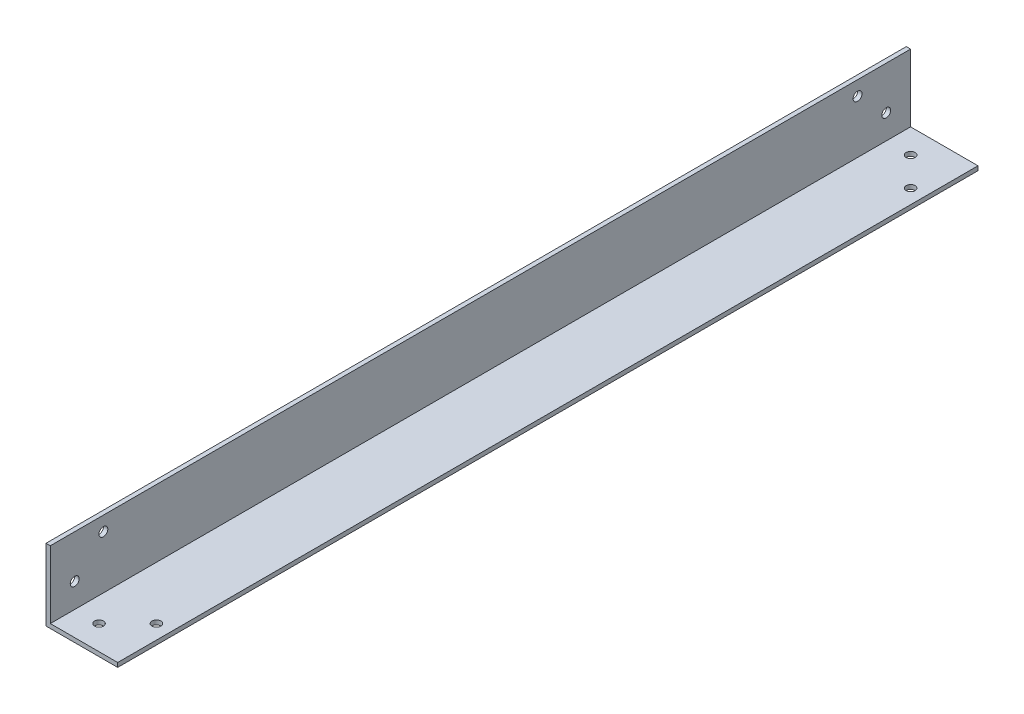
ISO-10303-21;
HEADER;
FILE_DESCRIPTION(('STEP AP214'),'2;1');
FILE_NAME('part.step','',(''),(''),'','','');
FILE_SCHEMA(('AUTOMOTIVE_DESIGN { 1 0 10303 214 1 1 1 1 }'));
ENDSEC;
DATA;
#1=APPLICATION_CONTEXT('core data for automotive mechanical design processes');
#2=APPLICATION_PROTOCOL_DEFINITION('international standard','automotive_design',2000,#1);
#3=PRODUCT_CONTEXT('',#1,'mechanical');
#4=PRODUCT('Part','Part','',(#3));
#5=PRODUCT_RELATED_PRODUCT_CATEGORY('part','',(#4));
#6=PRODUCT_DEFINITION_FORMATION('','',#4);
#7=PRODUCT_DEFINITION_CONTEXT('part definition',#1,'design');
#8=PRODUCT_DEFINITION('design','',#6,#7);
#9=PRODUCT_DEFINITION_SHAPE('','',#8);
#10=(LENGTH_UNIT() NAMED_UNIT(*) SI_UNIT(.MILLI.,.METRE.));
#11=(NAMED_UNIT(*) PLANE_ANGLE_UNIT() SI_UNIT($,.RADIAN.));
#12=(NAMED_UNIT(*) SI_UNIT($,.STERADIAN.) SOLID_ANGLE_UNIT());
#13=UNCERTAINTY_MEASURE_WITH_UNIT(LENGTH_MEASURE(1.E-05),#10,'distance_accuracy_value','');
#14=(GEOMETRIC_REPRESENTATION_CONTEXT(3) GLOBAL_UNCERTAINTY_ASSIGNED_CONTEXT((#13)) GLOBAL_UNIT_ASSIGNED_CONTEXT((#10,
#11,#12)) REPRESENTATION_CONTEXT('',''));
#15=CARTESIAN_POINT('',(0.,0.,0.));
#16=DIRECTION('',(0.,0.,1.));
#17=DIRECTION('',(1.,0.,0.));
#18=AXIS2_PLACEMENT_3D('',#15,#16,#17);
#19=CARTESIAN_POINT('',(25.,0.,300.));
#20=DIRECTION('',(0.,1.,0.));
#21=DIRECTION('',(-1.,0.,0.));
#22=AXIS2_PLACEMENT_3D('',#19,#20,#21);
#23=PLANE('',#22);
#24=CARTESIAN_POINT('',(9.99999999809248,0.,8.50000000000001));
#25=DIRECTION('',(0.,-1.,0.));
#26=DIRECTION('',(1.,0.,0.));
#27=AXIS2_PLACEMENT_3D('',#24,#25,#26);
#28=CIRCLE('',#27,1.55);
#29=CARTESIAN_POINT('',(11.5499999980925,0.,8.50000000000001));
#30=VERTEX_POINT('',#29);
#31=EDGE_CURVE('E156',#30,#30,#28,.T.);
#32=ORIENTED_EDGE('',*,*,#31,.F.);
#33=EDGE_LOOP('',(#32));
#34=FACE_BOUND('',#33,.T.);
#35=CARTESIAN_POINT('',(19.9999999961829,0.,18.5));
#36=DIRECTION('',(0.,-1.,0.));
#37=DIRECTION('',(1.,0.,0.));
#38=AXIS2_PLACEMENT_3D('',#35,#36,#37);
#39=CIRCLE('',#38,1.55);
#40=CARTESIAN_POINT('',(21.5499999961828,0.,18.5));
#41=VERTEX_POINT('',#40);
#42=EDGE_CURVE('E146',#41,#41,#39,.T.);
#43=ORIENTED_EDGE('',*,*,#42,.F.);
#44=EDGE_LOOP('',(#43));
#45=FACE_BOUND('',#44,.T.);
#46=CARTESIAN_POINT('',(9.99999999809244,0.,291.5));
#47=DIRECTION('',(0.,-1.,0.));
#48=DIRECTION('',(1.,0.,0.));
#49=AXIS2_PLACEMENT_3D('',#46,#47,#48);
#50=CIRCLE('',#49,1.55000000000001);
#51=CARTESIAN_POINT('',(11.5499999980925,0.,291.5));
#52=VERTEX_POINT('',#51);
#53=EDGE_CURVE('E143',#52,#52,#50,.T.);
#54=ORIENTED_EDGE('',*,*,#53,.F.);
#55=EDGE_LOOP('',(#54));
#56=FACE_BOUND('',#55,.T.);
#57=CARTESIAN_POINT('',(19.9999999961829,0.,281.5));
#58=DIRECTION('',(0.,-1.,0.));
#59=DIRECTION('',(1.,0.,0.));
#60=AXIS2_PLACEMENT_3D('',#57,#58,#59);
#61=CIRCLE('',#60,1.55000000000002);
#62=CARTESIAN_POINT('',(21.5499999961829,0.,281.5));
#63=VERTEX_POINT('',#62);
#64=EDGE_CURVE('E140',#63,#63,#61,.T.);
#65=ORIENTED_EDGE('',*,*,#64,.F.);
#66=EDGE_LOOP('',(#65));
#67=FACE_BOUND('',#66,.T.);
#68=DIRECTION('',(1.,0.,0.));
#69=VECTOR('',#68,1.);
#70=CARTESIAN_POINT('',(25.,0.,0.));
#71=LINE('',#70,#69);
#72=CARTESIAN_POINT('',(0.,0.,0.));
#73=VERTEX_POINT('',#72);
#74=CARTESIAN_POINT('',(25.,0.,0.));
#75=VERTEX_POINT('',#74);
#76=EDGE_CURVE('E119',#73,#75,#71,.T.);
#77=ORIENTED_EDGE('',*,*,#76,.T.);
#78=DIRECTION('',(0.,0.,-1.));
#79=VECTOR('',#78,1.);
#80=CARTESIAN_POINT('',(25.,0.,300.));
#81=LINE('',#80,#79);
#82=CARTESIAN_POINT('',(25.,0.,300.));
#83=VERTEX_POINT('',#82);
#84=EDGE_CURVE('E11',#83,#75,#81,.T.);
#85=ORIENTED_EDGE('',*,*,#84,.F.);
#86=DIRECTION('',(1.,0.,0.));
#87=VECTOR('',#86,1.);
#88=CARTESIAN_POINT('',(25.,0.,300.));
#89=LINE('',#88,#87);
#90=CARTESIAN_POINT('',(0.,0.,300.));
#91=VERTEX_POINT('',#90);
#92=EDGE_CURVE('E130',#91,#83,#89,.T.);
#93=ORIENTED_EDGE('',*,*,#92,.F.);
#94=DIRECTION('',(0.,0.,-1.));
#95=VECTOR('',#94,1.);
#96=CARTESIAN_POINT('',(0.,0.,300.));
#97=LINE('',#96,#95);
#98=EDGE_CURVE('E115',#91,#73,#97,.T.);
#99=ORIENTED_EDGE('',*,*,#98,.T.);
#100=EDGE_LOOP('',(#77,#85,#93,#99));
#101=FACE_BOUND('',#100,.T.);
#102=ADVANCED_FACE('F33',(#34,#45,#56,#67,#101),#23,.F.);
#103=CARTESIAN_POINT('',(25.,1.5,300.));
#104=DIRECTION('',(-1.,0.,0.));
#105=DIRECTION('',(0.,0.,1.));
#106=AXIS2_PLACEMENT_3D('',#103,#104,#105);
#107=PLANE('',#106);
#108=DIRECTION('',(0.,1.,0.));
#109=VECTOR('',#108,1.);
#110=CARTESIAN_POINT('',(25.,1.5,0.));
#111=LINE('',#110,#109);
#112=CARTESIAN_POINT('',(25.,1.5,0.));
#113=VERTEX_POINT('',#112);
#114=EDGE_CURVE('E122',#75,#113,#111,.T.);
#115=ORIENTED_EDGE('',*,*,#114,.T.);
#116=DIRECTION('',(0.,0.,-1.));
#117=VECTOR('',#116,1.);
#118=CARTESIAN_POINT('',(25.,1.5,300.));
#119=LINE('',#118,#117);
#120=CARTESIAN_POINT('',(25.,1.5,300.));
#121=VERTEX_POINT('',#120);
#122=EDGE_CURVE('E42',#121,#113,#119,.T.);
#123=ORIENTED_EDGE('',*,*,#122,.F.);
#124=DIRECTION('',(0.,1.,0.));
#125=VECTOR('',#124,1.);
#126=CARTESIAN_POINT('',(25.,1.5,300.));
#127=LINE('',#126,#125);
#128=EDGE_CURVE('E88',#83,#121,#127,.T.);
#129=ORIENTED_EDGE('',*,*,#128,.F.);
#130=ORIENTED_EDGE('',*,*,#84,.T.);
#131=EDGE_LOOP('',(#115,#123,#129,#130));
#132=FACE_BOUND('',#131,.T.);
#133=ADVANCED_FACE('F186',(#132),#107,.F.);
#134=CARTESIAN_POINT('',(1.5,1.5,300.));
#135=DIRECTION('',(0.,-1.,0.));
#136=DIRECTION('',(1.,0.,0.));
#137=AXIS2_PLACEMENT_3D('',#134,#135,#136);
#138=PLANE('',#137);
#139=CARTESIAN_POINT('',(9.99999999809248,1.5,8.50000000000001));
#140=DIRECTION('',(0.,-1.,0.));
#141=DIRECTION('',(1.,0.,0.));
#142=AXIS2_PLACEMENT_3D('',#139,#140,#141);
#143=CIRCLE('',#142,1.55);
#144=CARTESIAN_POINT('',(11.5499999980925,1.5,8.50000000000001));
#145=VERTEX_POINT('',#144);
#146=EDGE_CURVE('E36',#145,#145,#143,.T.);
#147=ORIENTED_EDGE('',*,*,#146,.T.);
#148=EDGE_LOOP('',(#147));
#149=FACE_BOUND('',#148,.T.);
#150=CARTESIAN_POINT('',(19.9999999961829,1.5,18.5));
#151=DIRECTION('',(0.,-1.,0.));
#152=DIRECTION('',(1.,0.,0.));
#153=AXIS2_PLACEMENT_3D('',#150,#151,#152);
#154=CIRCLE('',#153,1.55);
#155=CARTESIAN_POINT('',(21.5499999961828,1.5,18.5));
#156=VERTEX_POINT('',#155);
#157=EDGE_CURVE('E144',#156,#156,#154,.T.);
#158=ORIENTED_EDGE('',*,*,#157,.T.);
#159=EDGE_LOOP('',(#158));
#160=FACE_BOUND('',#159,.T.);
#161=CARTESIAN_POINT('',(9.99999999809244,1.5,291.5));
#162=DIRECTION('',(0.,-1.,0.));
#163=DIRECTION('',(1.,0.,0.));
#164=AXIS2_PLACEMENT_3D('',#161,#162,#163);
#165=CIRCLE('',#164,1.55000000000001);
#166=CARTESIAN_POINT('',(11.5499999980925,1.5,291.5));
#167=VERTEX_POINT('',#166);
#168=EDGE_CURVE('E141',#167,#167,#165,.T.);
#169=ORIENTED_EDGE('',*,*,#168,.T.);
#170=EDGE_LOOP('',(#169));
#171=FACE_BOUND('',#170,.T.);
#172=CARTESIAN_POINT('',(19.9999999961829,1.5,281.5));
#173=DIRECTION('',(0.,-1.,0.));
#174=DIRECTION('',(1.,0.,0.));
#175=AXIS2_PLACEMENT_3D('',#172,#173,#174);
#176=CIRCLE('',#175,1.55000000000002);
#177=CARTESIAN_POINT('',(21.5499999961829,1.5,281.5));
#178=VERTEX_POINT('',#177);
#179=EDGE_CURVE('E136',#178,#178,#176,.T.);
#180=ORIENTED_EDGE('',*,*,#179,.T.);
#181=EDGE_LOOP('',(#180));
#182=FACE_BOUND('',#181,.T.);
#183=DIRECTION('',(-1.,0.,0.));
#184=VECTOR('',#183,1.);
#185=CARTESIAN_POINT('',(1.5,1.5,0.));
#186=LINE('',#185,#184);
#187=CARTESIAN_POINT('',(1.5,1.5,0.));
#188=VERTEX_POINT('',#187);
#189=EDGE_CURVE('E125',#113,#188,#186,.T.);
#190=ORIENTED_EDGE('',*,*,#189,.T.);
#191=DIRECTION('',(0.,0.,-1.));
#192=VECTOR('',#191,1.);
#193=CARTESIAN_POINT('',(1.5,1.5,300.));
#194=LINE('',#193,#192);
#195=CARTESIAN_POINT('',(1.5,1.5,300.));
#196=VERTEX_POINT('',#195);
#197=EDGE_CURVE('E110',#196,#188,#194,.T.);
#198=ORIENTED_EDGE('',*,*,#197,.F.);
#199=DIRECTION('',(-1.,0.,0.));
#200=VECTOR('',#199,1.);
#201=CARTESIAN_POINT('',(1.5,1.5,300.));
#202=LINE('',#201,#200);
#203=EDGE_CURVE('E101',#121,#196,#202,.T.);
#204=ORIENTED_EDGE('',*,*,#203,.F.);
#205=ORIENTED_EDGE('',*,*,#122,.T.);
#206=EDGE_LOOP('',(#190,#198,#204,#205));
#207=FACE_BOUND('',#206,.T.);
#208=ADVANCED_FACE('F189',(#149,#160,#171,#182,#207),#138,.F.);
#209=CARTESIAN_POINT('',(1.5,25.,300.));
#210=DIRECTION('',(-1.,0.,0.));
#211=DIRECTION('',(0.,-1.,0.));
#212=AXIS2_PLACEMENT_3D('',#209,#210,#211);
#213=PLANE('',#212);
#214=CARTESIAN_POINT('',(1.5,10.,8.49999999999929));
#215=DIRECTION('',(-1.,0.,0.));
#216=DIRECTION('',(0.,-1.,0.));
#217=AXIS2_PLACEMENT_3D('',#214,#215,#216);
#218=CIRCLE('',#217,1.55);
#219=CARTESIAN_POINT('',(1.5,8.45000000000001,8.49999999999929));
#220=VERTEX_POINT('',#219);
#221=EDGE_CURVE('E163',#220,#220,#218,.T.);
#222=ORIENTED_EDGE('',*,*,#221,.T.);
#223=EDGE_LOOP('',(#222));
#224=FACE_BOUND('',#223,.T.);
#225=CARTESIAN_POINT('',(1.5,20.,18.4999999999993));
#226=DIRECTION('',(-1.,0.,0.));
#227=DIRECTION('',(0.,-1.,0.));
#228=AXIS2_PLACEMENT_3D('',#225,#226,#227);
#229=CIRCLE('',#228,1.55);
#230=CARTESIAN_POINT('',(1.5,18.45,18.4999999999993));
#231=VERTEX_POINT('',#230);
#232=EDGE_CURVE('E169',#231,#231,#229,.T.);
#233=ORIENTED_EDGE('',*,*,#232,.T.);
#234=EDGE_LOOP('',(#233));
#235=FACE_BOUND('',#234,.T.);
#236=CARTESIAN_POINT('',(1.5,10.,291.500000000001));
#237=DIRECTION('',(-1.,0.,0.));
#238=DIRECTION('',(0.,-1.,0.));
#239=AXIS2_PLACEMENT_3D('',#236,#237,#238);
#240=CIRCLE('',#239,1.54999999999999);
#241=CARTESIAN_POINT('',(1.5,8.45000000000002,291.500000000001));
#242=VERTEX_POINT('',#241);
#243=EDGE_CURVE('E175',#242,#242,#240,.T.);
#244=ORIENTED_EDGE('',*,*,#243,.T.);
#245=EDGE_LOOP('',(#244));
#246=FACE_BOUND('',#245,.T.);
#247=CARTESIAN_POINT('',(1.5,20.,281.500000000001));
#248=DIRECTION('',(-1.,0.,0.));
#249=DIRECTION('',(0.,-1.,0.));
#250=AXIS2_PLACEMENT_3D('',#247,#248,#249);
#251=CIRCLE('',#250,1.54999999999999);
#252=CARTESIAN_POINT('',(1.5,18.45,281.500000000001));
#253=VERTEX_POINT('',#252);
#254=EDGE_CURVE('E123',#253,#253,#251,.T.);
#255=ORIENTED_EDGE('',*,*,#254,.T.);
#256=EDGE_LOOP('',(#255));
#257=FACE_BOUND('',#256,.T.);
#258=DIRECTION('',(0.,1.,0.));
#259=VECTOR('',#258,1.);
#260=CARTESIAN_POINT('',(1.5,25.,0.));
#261=LINE('',#260,#259);
#262=CARTESIAN_POINT('',(1.5,25.,0.));
#263=VERTEX_POINT('',#262);
#264=EDGE_CURVE('E109',#188,#263,#261,.T.);
#265=ORIENTED_EDGE('',*,*,#264,.T.);
#266=DIRECTION('',(0.,0.,-1.));
#267=VECTOR('',#266,1.);
#268=CARTESIAN_POINT('',(1.5,25.,300.));
#269=LINE('',#268,#267);
#270=CARTESIAN_POINT('',(1.5,25.,300.));
#271=VERTEX_POINT('',#270);
#272=EDGE_CURVE('E106',#271,#263,#269,.T.);
#273=ORIENTED_EDGE('',*,*,#272,.F.);
#274=DIRECTION('',(0.,1.,0.));
#275=VECTOR('',#274,1.);
#276=CARTESIAN_POINT('',(1.5,25.,300.));
#277=LINE('',#276,#275);
#278=EDGE_CURVE('E95',#196,#271,#277,.T.);
#279=ORIENTED_EDGE('',*,*,#278,.F.);
#280=ORIENTED_EDGE('',*,*,#197,.T.);
#281=EDGE_LOOP('',(#265,#273,#279,#280));
#282=FACE_BOUND('',#281,.T.);
#283=ADVANCED_FACE('F107',(#224,#235,#246,#257,#282),#213,.F.);
#284=CARTESIAN_POINT('',(0.,25.,300.));
#285=DIRECTION('',(0.,-1.,0.));
#286=DIRECTION('',(0.,0.,-1.));
#287=AXIS2_PLACEMENT_3D('',#284,#285,#286);
#288=PLANE('',#287);
#289=DIRECTION('',(-1.,0.,0.));
#290=VECTOR('',#289,1.);
#291=CARTESIAN_POINT('',(0.,25.,0.));
#292=LINE('',#291,#290);
#293=CARTESIAN_POINT('',(0.,25.,0.));
#294=VERTEX_POINT('',#293);
#295=EDGE_CURVE('E74',#263,#294,#292,.T.);
#296=ORIENTED_EDGE('',*,*,#295,.T.);
#297=DIRECTION('',(0.,0.,-1.));
#298=VECTOR('',#297,1.);
#299=CARTESIAN_POINT('',(0.,25.,300.));
#300=LINE('',#299,#298);
#301=CARTESIAN_POINT('',(0.,25.,300.));
#302=VERTEX_POINT('',#301);
#303=EDGE_CURVE('E111',#302,#294,#300,.T.);
#304=ORIENTED_EDGE('',*,*,#303,.F.);
#305=DIRECTION('',(-1.,0.,0.));
#306=VECTOR('',#305,1.);
#307=CARTESIAN_POINT('',(0.,25.,300.));
#308=LINE('',#307,#306);
#309=EDGE_CURVE('E99',#271,#302,#308,.T.);
#310=ORIENTED_EDGE('',*,*,#309,.F.);
#311=ORIENTED_EDGE('',*,*,#272,.T.);
#312=EDGE_LOOP('',(#296,#304,#310,#311));
#313=FACE_BOUND('',#312,.T.);
#314=ADVANCED_FACE('F113',(#313),#288,.F.);
#315=CARTESIAN_POINT('',(0.,0.,300.));
#316=DIRECTION('',(1.,0.,0.));
#317=DIRECTION('',(0.,0.,-1.));
#318=AXIS2_PLACEMENT_3D('',#315,#316,#317);
#319=PLANE('',#318);
#320=CARTESIAN_POINT('',(0.,10.,8.49999999999929));
#321=DIRECTION('',(-1.,0.,0.));
#322=DIRECTION('',(0.,0.,1.));
#323=AXIS2_PLACEMENT_3D('',#320,#321,#322);
#324=CIRCLE('',#323,1.55);
#325=CARTESIAN_POINT('',(0.,10.,10.0499999999993));
#326=VERTEX_POINT('',#325);
#327=EDGE_CURVE('E139',#326,#326,#324,.T.);
#328=ORIENTED_EDGE('',*,*,#327,.F.);
#329=EDGE_LOOP('',(#328));
#330=FACE_BOUND('',#329,.T.);
#331=CARTESIAN_POINT('',(0.,20.,18.4999999999993));
#332=DIRECTION('',(-1.,0.,0.));
#333=DIRECTION('',(0.,0.,1.));
#334=AXIS2_PLACEMENT_3D('',#331,#332,#333);
#335=CIRCLE('',#334,1.55);
#336=CARTESIAN_POINT('',(0.,20.,20.0499999999993));
#337=VERTEX_POINT('',#336);
#338=EDGE_CURVE('E166',#337,#337,#335,.T.);
#339=ORIENTED_EDGE('',*,*,#338,.F.);
#340=EDGE_LOOP('',(#339));
#341=FACE_BOUND('',#340,.T.);
#342=CARTESIAN_POINT('',(0.,10.,291.500000000001));
#343=DIRECTION('',(-1.,0.,0.));
#344=DIRECTION('',(0.,0.,1.));
#345=AXIS2_PLACEMENT_3D('',#342,#343,#344);
#346=CIRCLE('',#345,1.54999999999999);
#347=CARTESIAN_POINT('',(0.,10.,293.050000000001));
#348=VERTEX_POINT('',#347);
#349=EDGE_CURVE('E172',#348,#348,#346,.T.);
#350=ORIENTED_EDGE('',*,*,#349,.F.);
#351=EDGE_LOOP('',(#350));
#352=FACE_BOUND('',#351,.T.);
#353=CARTESIAN_POINT('',(0.,20.,281.500000000001));
#354=DIRECTION('',(-1.,0.,0.));
#355=DIRECTION('',(0.,0.,1.));
#356=AXIS2_PLACEMENT_3D('',#353,#354,#355);
#357=CIRCLE('',#356,1.54999999999999);
#358=CARTESIAN_POINT('',(0.,20.,283.050000000001));
#359=VERTEX_POINT('',#358);
#360=EDGE_CURVE('E178',#359,#359,#357,.T.);
#361=ORIENTED_EDGE('',*,*,#360,.F.);
#362=EDGE_LOOP('',(#361));
#363=FACE_BOUND('',#362,.T.);
#364=DIRECTION('',(0.,-1.,0.));
#365=VECTOR('',#364,1.);
#366=CARTESIAN_POINT('',(0.,0.,0.));
#367=LINE('',#366,#365);
#368=EDGE_CURVE('E80',#294,#73,#367,.T.);
#369=ORIENTED_EDGE('',*,*,#368,.T.);
#370=ORIENTED_EDGE('',*,*,#98,.F.);
#371=DIRECTION('',(0.,-1.,0.));
#372=VECTOR('',#371,1.);
#373=CARTESIAN_POINT('',(0.,0.,300.));
#374=LINE('',#373,#372);
#375=EDGE_CURVE('E51',#302,#91,#374,.T.);
#376=ORIENTED_EDGE('',*,*,#375,.F.);
#377=ORIENTED_EDGE('',*,*,#303,.T.);
#378=EDGE_LOOP('',(#369,#370,#376,#377));
#379=FACE_BOUND('',#378,.T.);
#380=ADVANCED_FACE('F194',(#330,#341,#352,#363,#379),#319,.F.);
#381=CARTESIAN_POINT('',(0.,0.,300.));
#382=DIRECTION('',(0.,0.,-1.));
#383=DIRECTION('',(-1.,0.,0.));
#384=AXIS2_PLACEMENT_3D('',#381,#382,#383);
#385=PLANE('',#384);
#386=ORIENTED_EDGE('',*,*,#92,.T.);
#387=ORIENTED_EDGE('',*,*,#128,.T.);
#388=ORIENTED_EDGE('',*,*,#203,.T.);
#389=ORIENTED_EDGE('',*,*,#278,.T.);
#390=ORIENTED_EDGE('',*,*,#309,.T.);
#391=ORIENTED_EDGE('',*,*,#375,.T.);
#392=EDGE_LOOP('',(#386,#387,#388,#389,#390,#391));
#393=FACE_BOUND('',#392,.T.);
#394=ADVANCED_FACE('F97',(#393),#385,.F.);
#395=CARTESIAN_POINT('',(0.,0.,0.));
#396=DIRECTION('',(0.,0.,-1.));
#397=DIRECTION('',(-1.,0.,0.));
#398=AXIS2_PLACEMENT_3D('',#395,#396,#397);
#399=PLANE('',#398);
#400=ORIENTED_EDGE('',*,*,#76,.F.);
#401=ORIENTED_EDGE('',*,*,#368,.F.);
#402=ORIENTED_EDGE('',*,*,#295,.F.);
#403=ORIENTED_EDGE('',*,*,#264,.F.);
#404=ORIENTED_EDGE('',*,*,#189,.F.);
#405=ORIENTED_EDGE('',*,*,#114,.F.);
#406=EDGE_LOOP('',(#400,#401,#402,#403,#404,#405));
#407=FACE_BOUND('',#406,.T.);
#408=ADVANCED_FACE('F192',(#407),#399,.T.);
#409=CARTESIAN_POINT('',(10.,20.,281.500000000001));
#410=DIRECTION('',(-1.,0.,0.));
#411=DIRECTION('',(0.,0.,1.));
#412=AXIS2_PLACEMENT_3D('',#409,#410,#411);
#413=CYLINDRICAL_SURFACE('',#412,1.54999999999999);
#414=ORIENTED_EDGE('',*,*,#360,.T.);
#415=EDGE_LOOP('',(#414));
#416=FACE_BOUND('',#415,.T.);
#417=ORIENTED_EDGE('',*,*,#254,.F.);
#418=EDGE_LOOP('',(#417));
#419=FACE_BOUND('',#418,.T.);
#420=ADVANCED_FACE('F264',(#416,#419),#413,.F.);
#421=CARTESIAN_POINT('',(10.,10.,291.500000000001));
#422=DIRECTION('',(-1.,0.,0.));
#423=DIRECTION('',(0.,0.,1.));
#424=AXIS2_PLACEMENT_3D('',#421,#422,#423);
#425=CYLINDRICAL_SURFACE('',#424,1.54999999999999);
#426=ORIENTED_EDGE('',*,*,#349,.T.);
#427=EDGE_LOOP('',(#426));
#428=FACE_BOUND('',#427,.T.);
#429=ORIENTED_EDGE('',*,*,#243,.F.);
#430=EDGE_LOOP('',(#429));
#431=FACE_BOUND('',#430,.T.);
#432=ADVANCED_FACE('F260',(#428,#431),#425,.F.);
#433=CARTESIAN_POINT('',(10.,20.,18.4999999999993));
#434=DIRECTION('',(-1.,0.,0.));
#435=DIRECTION('',(0.,0.,1.));
#436=AXIS2_PLACEMENT_3D('',#433,#434,#435);
#437=CYLINDRICAL_SURFACE('',#436,1.55);
#438=ORIENTED_EDGE('',*,*,#338,.T.);
#439=EDGE_LOOP('',(#438));
#440=FACE_BOUND('',#439,.T.);
#441=ORIENTED_EDGE('',*,*,#232,.F.);
#442=EDGE_LOOP('',(#441));
#443=FACE_BOUND('',#442,.T.);
#444=ADVANCED_FACE('F256',(#440,#443),#437,.F.);
#445=CARTESIAN_POINT('',(10.,10.,8.49999999999929));
#446=DIRECTION('',(-1.,0.,0.));
#447=DIRECTION('',(0.,0.,1.));
#448=AXIS2_PLACEMENT_3D('',#445,#446,#447);
#449=CYLINDRICAL_SURFACE('',#448,1.55);
#450=ORIENTED_EDGE('',*,*,#327,.T.);
#451=EDGE_LOOP('',(#450));
#452=FACE_BOUND('',#451,.T.);
#453=ORIENTED_EDGE('',*,*,#221,.F.);
#454=EDGE_LOOP('',(#453));
#455=FACE_BOUND('',#454,.T.);
#456=ADVANCED_FACE('F228',(#452,#455),#449,.F.);
#457=CARTESIAN_POINT('',(19.9999999961829,10.,281.5));
#458=DIRECTION('',(0.,-1.,0.));
#459=DIRECTION('',(1.,0.,0.));
#460=AXIS2_PLACEMENT_3D('',#457,#458,#459);
#461=CYLINDRICAL_SURFACE('',#460,1.55000000000002);
#462=ORIENTED_EDGE('',*,*,#64,.T.);
#463=EDGE_LOOP('',(#462));
#464=FACE_BOUND('',#463,.T.);
#465=ORIENTED_EDGE('',*,*,#179,.F.);
#466=EDGE_LOOP('',(#465));
#467=FACE_BOUND('',#466,.T.);
#468=ADVANCED_FACE('F224',(#464,#467),#461,.F.);
#469=CARTESIAN_POINT('',(9.99999999809244,10.,291.5));
#470=DIRECTION('',(0.,-1.,0.));
#471=DIRECTION('',(1.,0.,0.));
#472=AXIS2_PLACEMENT_3D('',#469,#470,#471);
#473=CYLINDRICAL_SURFACE('',#472,1.55000000000001);
#474=ORIENTED_EDGE('',*,*,#53,.T.);
#475=EDGE_LOOP('',(#474));
#476=FACE_BOUND('',#475,.T.);
#477=ORIENTED_EDGE('',*,*,#168,.F.);
#478=EDGE_LOOP('',(#477));
#479=FACE_BOUND('',#478,.T.);
#480=ADVANCED_FACE('F227',(#476,#479),#473,.F.);
#481=CARTESIAN_POINT('',(19.9999999961829,10.,18.5));
#482=DIRECTION('',(0.,-1.,0.));
#483=DIRECTION('',(1.,0.,0.));
#484=AXIS2_PLACEMENT_3D('',#481,#482,#483);
#485=CYLINDRICAL_SURFACE('',#484,1.55);
#486=ORIENTED_EDGE('',*,*,#42,.T.);
#487=EDGE_LOOP('',(#486));
#488=FACE_BOUND('',#487,.T.);
#489=ORIENTED_EDGE('',*,*,#157,.F.);
#490=EDGE_LOOP('',(#489));
#491=FACE_BOUND('',#490,.T.);
#492=ADVANCED_FACE('F244',(#488,#491),#485,.F.);
#493=CARTESIAN_POINT('',(9.99999999809248,10.,8.50000000000001));
#494=DIRECTION('',(0.,-1.,0.));
#495=DIRECTION('',(1.,0.,0.));
#496=AXIS2_PLACEMENT_3D('',#493,#494,#495);
#497=CYLINDRICAL_SURFACE('',#496,1.55);
#498=ORIENTED_EDGE('',*,*,#31,.T.);
#499=EDGE_LOOP('',(#498));
#500=FACE_BOUND('',#499,.T.);
#501=ORIENTED_EDGE('',*,*,#146,.F.);
#502=EDGE_LOOP('',(#501));
#503=FACE_BOUND('',#502,.T.);
#504=ADVANCED_FACE('F250',(#500,#503),#497,.F.);
#505=CLOSED_SHELL('',(#102,#133,#208,#283,#314,#380,#394,#408,#420,#432,#444,#456,#468,#480,
#492,#504));
#506=MANIFOLD_SOLID_BREP('B2',#505);
#507=ADVANCED_BREP_SHAPE_REPRESENTATION('',(#18,#506),#14);
#508=SHAPE_DEFINITION_REPRESENTATION(#9,#507);
ENDSEC;
END-ISO-10303-21;
